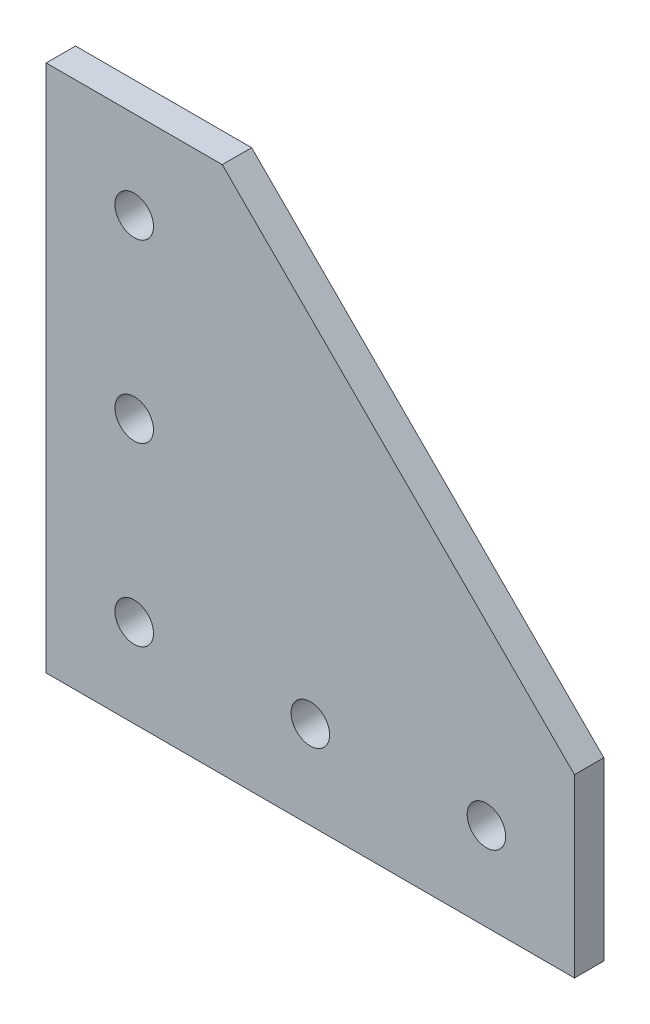
ISO-10303-21;
HEADER;
FILE_DESCRIPTION(('STEP AP214'),'2;1');
FILE_NAME('part.step','',(''),(''),'','','');
FILE_SCHEMA(('AUTOMOTIVE_DESIGN { 1 0 10303 214 1 1 1 1 }'));
ENDSEC;
DATA;
#1=APPLICATION_CONTEXT('core data for automotive mechanical design processes');
#2=APPLICATION_PROTOCOL_DEFINITION('international standard','automotive_design',2000,#1);
#3=PRODUCT_CONTEXT('',#1,'mechanical');
#4=PRODUCT('Part','Part','',(#3));
#5=PRODUCT_RELATED_PRODUCT_CATEGORY('part','',(#4));
#6=PRODUCT_DEFINITION_FORMATION('','',#4);
#7=PRODUCT_DEFINITION_CONTEXT('part definition',#1,'design');
#8=PRODUCT_DEFINITION('design','',#6,#7);
#9=PRODUCT_DEFINITION_SHAPE('','',#8);
#10=(LENGTH_UNIT() NAMED_UNIT(*) SI_UNIT(.MILLI.,.METRE.));
#11=(NAMED_UNIT(*) PLANE_ANGLE_UNIT() SI_UNIT($,.RADIAN.));
#12=(NAMED_UNIT(*) SI_UNIT($,.STERADIAN.) SOLID_ANGLE_UNIT());
#13=UNCERTAINTY_MEASURE_WITH_UNIT(LENGTH_MEASURE(1.E-05),#10,'distance_accuracy_value','');
#14=(GEOMETRIC_REPRESENTATION_CONTEXT(3) GLOBAL_UNCERTAINTY_ASSIGNED_CONTEXT((#13)) GLOBAL_UNIT_ASSIGNED_CONTEXT((#10,
#11,#12)) REPRESENTATION_CONTEXT('',''));
#15=CARTESIAN_POINT('',(0.,0.,0.));
#16=DIRECTION('',(0.,0.,1.));
#17=DIRECTION('',(1.,0.,0.));
#18=AXIS2_PLACEMENT_3D('',#15,#16,#17);
#19=CARTESIAN_POINT('',(114.3,0.,6.35));
#20=DIRECTION('',(0.,1.,0.));
#21=DIRECTION('',(-1.,0.,0.));
#22=AXIS2_PLACEMENT_3D('',#19,#20,#21);
#23=PLANE('',#22);
#24=DIRECTION('',(1.,0.,0.));
#25=VECTOR('',#24,1.);
#26=CARTESIAN_POINT('',(114.3,0.,0.));
#27=LINE('',#26,#25);
#28=CARTESIAN_POINT('',(0.,0.,0.));
#29=VERTEX_POINT('',#28);
#30=CARTESIAN_POINT('',(114.3,0.,0.));
#31=VERTEX_POINT('',#30);
#32=EDGE_CURVE('E83',#29,#31,#27,.T.);
#33=ORIENTED_EDGE('',*,*,#32,.T.);
#34=DIRECTION('',(0.,0.,-1.));
#35=VECTOR('',#34,1.);
#36=CARTESIAN_POINT('',(114.3,0.,6.35));
#37=LINE('',#36,#35);
#38=CARTESIAN_POINT('',(114.3,0.,6.35));
#39=VERTEX_POINT('',#38);
#40=EDGE_CURVE('E91',#39,#31,#37,.T.);
#41=ORIENTED_EDGE('',*,*,#40,.F.);
#42=DIRECTION('',(1.,0.,0.));
#43=VECTOR('',#42,1.);
#44=CARTESIAN_POINT('',(114.3,0.,6.35));
#45=LINE('',#44,#43);
#46=CARTESIAN_POINT('',(0.,0.,6.35));
#47=VERTEX_POINT('',#46);
#48=EDGE_CURVE('E112',#47,#39,#45,.T.);
#49=ORIENTED_EDGE('',*,*,#48,.F.);
#50=DIRECTION('',(0.,0.,-1.));
#51=VECTOR('',#50,1.);
#52=CARTESIAN_POINT('',(0.,0.,6.35));
#53=LINE('',#52,#51);
#54=EDGE_CURVE('E99',#47,#29,#53,.T.);
#55=ORIENTED_EDGE('',*,*,#54,.T.);
#56=EDGE_LOOP('',(#33,#41,#49,#55));
#57=FACE_BOUND('',#56,.T.);
#58=ADVANCED_FACE('F30',(#57),#23,.F.);
#59=CARTESIAN_POINT('',(114.3,38.1,6.35));
#60=DIRECTION('',(-1.,0.,0.));
#61=DIRECTION('',(0.,-1.,0.));
#62=AXIS2_PLACEMENT_3D('',#59,#60,#61);
#63=PLANE('',#62);
#64=DIRECTION('',(0.,1.,0.));
#65=VECTOR('',#64,1.);
#66=CARTESIAN_POINT('',(114.3,38.1,0.));
#67=LINE('',#66,#65);
#68=CARTESIAN_POINT('',(114.3,38.1,0.));
#69=VERTEX_POINT('',#68);
#70=EDGE_CURVE('E77',#31,#69,#67,.T.);
#71=ORIENTED_EDGE('',*,*,#70,.T.);
#72=DIRECTION('',(0.,0.,-1.));
#73=VECTOR('',#72,1.);
#74=CARTESIAN_POINT('',(114.3,38.1,6.35));
#75=LINE('',#74,#73);
#76=CARTESIAN_POINT('',(114.3,38.1,6.35));
#77=VERTEX_POINT('',#76);
#78=EDGE_CURVE('E96',#77,#69,#75,.T.);
#79=ORIENTED_EDGE('',*,*,#78,.F.);
#80=DIRECTION('',(0.,1.,0.));
#81=VECTOR('',#80,1.);
#82=CARTESIAN_POINT('',(114.3,38.1,6.35));
#83=LINE('',#82,#81);
#84=EDGE_CURVE('E93',#39,#77,#83,.T.);
#85=ORIENTED_EDGE('',*,*,#84,.F.);
#86=ORIENTED_EDGE('',*,*,#40,.T.);
#87=EDGE_LOOP('',(#71,#79,#85,#86));
#88=FACE_BOUND('',#87,.T.);
#89=ADVANCED_FACE('F92',(#88),#63,.F.);
#90=CARTESIAN_POINT('',(38.1,114.3,6.35));
#91=DIRECTION('',(-0.707106781186547,-0.707106781186548,0.));
#92=DIRECTION('',(0.707106781186548,-0.707106781186547,0.));
#93=AXIS2_PLACEMENT_3D('',#90,#91,#92);
#94=PLANE('',#93);
#95=DIRECTION('',(-0.707106781186548,0.707106781186547,0.));
#96=VECTOR('',#95,1.);
#97=CARTESIAN_POINT('',(38.1,114.3,0.));
#98=LINE('',#97,#96);
#99=CARTESIAN_POINT('',(38.1,114.3,0.));
#100=VERTEX_POINT('',#99);
#101=EDGE_CURVE('E85',#69,#100,#98,.T.);
#102=ORIENTED_EDGE('',*,*,#101,.T.);
#103=DIRECTION('',(0.,0.,-1.));
#104=VECTOR('',#103,1.);
#105=CARTESIAN_POINT('',(38.1,114.3,6.35));
#106=LINE('',#105,#104);
#107=CARTESIAN_POINT('',(38.1,114.3,6.35));
#108=VERTEX_POINT('',#107);
#109=EDGE_CURVE('E123',#108,#100,#106,.T.);
#110=ORIENTED_EDGE('',*,*,#109,.F.);
#111=DIRECTION('',(-0.707106781186548,0.707106781186547,0.));
#112=VECTOR('',#111,1.);
#113=CARTESIAN_POINT('',(38.1,114.3,6.35));
#114=LINE('',#113,#112);
#115=EDGE_CURVE('E115',#77,#108,#114,.T.);
#116=ORIENTED_EDGE('',*,*,#115,.F.);
#117=ORIENTED_EDGE('',*,*,#78,.T.);
#118=EDGE_LOOP('',(#102,#110,#116,#117));
#119=FACE_BOUND('',#118,.T.);
#120=ADVANCED_FACE('F156',(#119),#94,.F.);
#121=CARTESIAN_POINT('',(0.,114.3,6.35));
#122=DIRECTION('',(0.,-1.,0.));
#123=DIRECTION('',(0.,0.,-1.));
#124=AXIS2_PLACEMENT_3D('',#121,#122,#123);
#125=PLANE('',#124);
#126=DIRECTION('',(-1.,0.,0.));
#127=VECTOR('',#126,1.);
#128=CARTESIAN_POINT('',(0.,114.3,0.));
#129=LINE('',#128,#127);
#130=CARTESIAN_POINT('',(0.,114.3,0.));
#131=VERTEX_POINT('',#130);
#132=EDGE_CURVE('E108',#100,#131,#129,.T.);
#133=ORIENTED_EDGE('',*,*,#132,.T.);
#134=DIRECTION('',(0.,0.,-1.));
#135=VECTOR('',#134,1.);
#136=CARTESIAN_POINT('',(0.,114.3,6.35));
#137=LINE('',#136,#135);
#138=CARTESIAN_POINT('',(0.,114.3,6.35));
#139=VERTEX_POINT('',#138);
#140=EDGE_CURVE('E120',#139,#131,#137,.T.);
#141=ORIENTED_EDGE('',*,*,#140,.F.);
#142=DIRECTION('',(-1.,0.,0.));
#143=VECTOR('',#142,1.);
#144=CARTESIAN_POINT('',(0.,114.3,6.35));
#145=LINE('',#144,#143);
#146=EDGE_CURVE('E50',#108,#139,#145,.T.);
#147=ORIENTED_EDGE('',*,*,#146,.F.);
#148=ORIENTED_EDGE('',*,*,#109,.T.);
#149=EDGE_LOOP('',(#133,#141,#147,#148));
#150=FACE_BOUND('',#149,.T.);
#151=ADVANCED_FACE('F147',(#150),#125,.F.);
#152=CARTESIAN_POINT('',(0.,0.,6.35));
#153=DIRECTION('',(1.,0.,0.));
#154=DIRECTION('',(0.,0.,-1.));
#155=AXIS2_PLACEMENT_3D('',#152,#153,#154);
#156=PLANE('',#155);
#157=DIRECTION('',(0.,-1.,0.));
#158=VECTOR('',#157,1.);
#159=CARTESIAN_POINT('',(0.,0.,0.));
#160=LINE('',#159,#158);
#161=EDGE_CURVE('E110',#131,#29,#160,.T.);
#162=ORIENTED_EDGE('',*,*,#161,.T.);
#163=ORIENTED_EDGE('',*,*,#54,.F.);
#164=DIRECTION('',(0.,-1.,0.));
#165=VECTOR('',#164,1.);
#166=CARTESIAN_POINT('',(0.,0.,6.35));
#167=LINE('',#166,#165);
#168=EDGE_CURVE('E45',#139,#47,#167,.T.);
#169=ORIENTED_EDGE('',*,*,#168,.F.);
#170=ORIENTED_EDGE('',*,*,#140,.T.);
#171=EDGE_LOOP('',(#162,#163,#169,#170));
#172=FACE_BOUND('',#171,.T.);
#173=ADVANCED_FACE('F137',(#172),#156,.F.);
#174=CARTESIAN_POINT('',(0.,0.,6.35));
#175=DIRECTION('',(0.,0.,-1.));
#176=DIRECTION('',(-1.,0.,0.));
#177=AXIS2_PLACEMENT_3D('',#174,#175,#176);
#178=PLANE('',#177);
#179=CARTESIAN_POINT('',(19.05,95.25,6.35));
#180=DIRECTION('',(0.,0.,1.));
#181=DIRECTION('',(1.,0.,0.));
#182=AXIS2_PLACEMENT_3D('',#179,#180,#181);
#183=CIRCLE('',#182,4.1656);
#184=CARTESIAN_POINT('',(23.2156,95.25,6.35));
#185=VERTEX_POINT('',#184);
#186=EDGE_CURVE('E236',#185,#185,#183,.T.);
#187=ORIENTED_EDGE('',*,*,#186,.F.);
#188=EDGE_LOOP('',(#187));
#189=FACE_BOUND('',#188,.T.);
#190=CARTESIAN_POINT('',(19.05,57.15,6.35));
#191=DIRECTION('',(0.,0.,1.));
#192=DIRECTION('',(1.,0.,0.));
#193=AXIS2_PLACEMENT_3D('',#190,#191,#192);
#194=CIRCLE('',#193,4.1656);
#195=CARTESIAN_POINT('',(23.2156,57.15,6.35));
#196=VERTEX_POINT('',#195);
#197=EDGE_CURVE('E237',#196,#196,#194,.T.);
#198=ORIENTED_EDGE('',*,*,#197,.F.);
#199=EDGE_LOOP('',(#198));
#200=FACE_BOUND('',#199,.T.);
#201=CARTESIAN_POINT('',(57.15,19.05,6.35));
#202=DIRECTION('',(0.,0.,1.));
#203=DIRECTION('',(1.,0.,0.));
#204=AXIS2_PLACEMENT_3D('',#201,#202,#203);
#205=CIRCLE('',#204,4.1656);
#206=CARTESIAN_POINT('',(61.3156,19.05,6.35));
#207=VERTEX_POINT('',#206);
#208=EDGE_CURVE('E249',#207,#207,#205,.T.);
#209=ORIENTED_EDGE('',*,*,#208,.F.);
#210=EDGE_LOOP('',(#209));
#211=FACE_BOUND('',#210,.T.);
#212=CARTESIAN_POINT('',(19.05,19.05,6.35));
#213=DIRECTION('',(0.,0.,1.));
#214=DIRECTION('',(1.,0.,0.));
#215=AXIS2_PLACEMENT_3D('',#212,#213,#214);
#216=CIRCLE('',#215,4.1656);
#217=CARTESIAN_POINT('',(23.2156,19.05,6.35));
#218=VERTEX_POINT('',#217);
#219=EDGE_CURVE('E103',#218,#218,#216,.T.);
#220=ORIENTED_EDGE('',*,*,#219,.F.);
#221=EDGE_LOOP('',(#220));
#222=FACE_BOUND('',#221,.T.);
#223=ORIENTED_EDGE('',*,*,#48,.T.);
#224=ORIENTED_EDGE('',*,*,#84,.T.);
#225=ORIENTED_EDGE('',*,*,#115,.T.);
#226=ORIENTED_EDGE('',*,*,#146,.T.);
#227=ORIENTED_EDGE('',*,*,#168,.T.);
#228=EDGE_LOOP('',(#223,#224,#225,#226,#227));
#229=FACE_BOUND('',#228,.T.);
#230=CARTESIAN_POINT('',(95.25,19.05,6.35));
#231=DIRECTION('',(0.,0.,1.));
#232=DIRECTION('',(1.,0.,0.));
#233=AXIS2_PLACEMENT_3D('',#230,#231,#232);
#234=CIRCLE('',#233,4.1656);
#235=CARTESIAN_POINT('',(99.4156,19.05,6.35));
#236=VERTEX_POINT('',#235);
#237=EDGE_CURVE('E11',#236,#236,#234,.T.);
#238=ORIENTED_EDGE('',*,*,#237,.F.);
#239=EDGE_LOOP('',(#238));
#240=FACE_BOUND('',#239,.T.);
#241=ADVANCED_FACE('F135',(#189,#200,#211,#222,#229,#240),#178,.F.);
#242=CARTESIAN_POINT('',(0.,0.,0.));
#243=DIRECTION('',(0.,0.,-1.));
#244=DIRECTION('',(-1.,0.,0.));
#245=AXIS2_PLACEMENT_3D('',#242,#243,#244);
#246=PLANE('',#245);
#247=CARTESIAN_POINT('',(19.05,95.25,0.));
#248=DIRECTION('',(0.,0.,1.));
#249=DIRECTION('',(1.,0.,0.));
#250=AXIS2_PLACEMENT_3D('',#247,#248,#249);
#251=CIRCLE('',#250,4.1656);
#252=CARTESIAN_POINT('',(23.2156,95.25,0.));
#253=VERTEX_POINT('',#252);
#254=EDGE_CURVE('E234',#253,#253,#251,.T.);
#255=ORIENTED_EDGE('',*,*,#254,.T.);
#256=EDGE_LOOP('',(#255));
#257=FACE_BOUND('',#256,.T.);
#258=CARTESIAN_POINT('',(19.05,57.15,0.));
#259=DIRECTION('',(0.,0.,1.));
#260=DIRECTION('',(1.,0.,0.));
#261=AXIS2_PLACEMENT_3D('',#258,#259,#260);
#262=CIRCLE('',#261,4.1656);
#263=CARTESIAN_POINT('',(23.2156,57.15,0.));
#264=VERTEX_POINT('',#263);
#265=EDGE_CURVE('E240',#264,#264,#262,.T.);
#266=ORIENTED_EDGE('',*,*,#265,.T.);
#267=EDGE_LOOP('',(#266));
#268=FACE_BOUND('',#267,.T.);
#269=CARTESIAN_POINT('',(57.15,19.05,0.));
#270=DIRECTION('',(0.,0.,1.));
#271=DIRECTION('',(1.,0.,0.));
#272=AXIS2_PLACEMENT_3D('',#269,#270,#271);
#273=CIRCLE('',#272,4.1656);
#274=CARTESIAN_POINT('',(61.3156,19.05,0.));
#275=VERTEX_POINT('',#274);
#276=EDGE_CURVE('E246',#275,#275,#273,.T.);
#277=ORIENTED_EDGE('',*,*,#276,.T.);
#278=EDGE_LOOP('',(#277));
#279=FACE_BOUND('',#278,.T.);
#280=CARTESIAN_POINT('',(19.05,19.05,0.));
#281=DIRECTION('',(0.,0.,1.));
#282=DIRECTION('',(1.,0.,0.));
#283=AXIS2_PLACEMENT_3D('',#280,#281,#282);
#284=CIRCLE('',#283,4.1656);
#285=CARTESIAN_POINT('',(23.2156,19.05,0.));
#286=VERTEX_POINT('',#285);
#287=EDGE_CURVE('E100',#286,#286,#284,.T.);
#288=ORIENTED_EDGE('',*,*,#287,.T.);
#289=EDGE_LOOP('',(#288));
#290=FACE_BOUND('',#289,.T.);
#291=ORIENTED_EDGE('',*,*,#32,.F.);
#292=ORIENTED_EDGE('',*,*,#161,.F.);
#293=ORIENTED_EDGE('',*,*,#132,.F.);
#294=ORIENTED_EDGE('',*,*,#101,.F.);
#295=ORIENTED_EDGE('',*,*,#70,.F.);
#296=EDGE_LOOP('',(#291,#292,#293,#294,#295));
#297=FACE_BOUND('',#296,.T.);
#298=CARTESIAN_POINT('',(95.25,19.05,0.));
#299=DIRECTION('',(0.,0.,1.));
#300=DIRECTION('',(1.,0.,0.));
#301=AXIS2_PLACEMENT_3D('',#298,#299,#300);
#302=CIRCLE('',#301,4.1656);
#303=CARTESIAN_POINT('',(99.4156,19.05,0.));
#304=VERTEX_POINT('',#303);
#305=EDGE_CURVE('E38',#304,#304,#302,.T.);
#306=ORIENTED_EDGE('',*,*,#305,.T.);
#307=EDGE_LOOP('',(#306));
#308=FACE_BOUND('',#307,.T.);
#309=ADVANCED_FACE('F79',(#257,#268,#279,#290,#297,#308),#246,.T.);
#310=CARTESIAN_POINT('',(19.05,19.05,0.));
#311=DIRECTION('',(0.,0.,1.));
#312=DIRECTION('',(1.,0.,0.));
#313=AXIS2_PLACEMENT_3D('',#310,#311,#312);
#314=CYLINDRICAL_SURFACE('',#313,4.1656);
#315=ORIENTED_EDGE('',*,*,#287,.F.);
#316=EDGE_LOOP('',(#315));
#317=FACE_BOUND('',#316,.T.);
#318=ORIENTED_EDGE('',*,*,#219,.T.);
#319=EDGE_LOOP('',(#318));
#320=FACE_BOUND('',#319,.T.);
#321=ADVANCED_FACE('F144',(#317,#320),#314,.F.);
#322=CARTESIAN_POINT('',(57.15,19.05,0.));
#323=DIRECTION('',(0.,0.,1.));
#324=DIRECTION('',(1.,0.,0.));
#325=AXIS2_PLACEMENT_3D('',#322,#323,#324);
#326=CYLINDRICAL_SURFACE('',#325,4.1656);
#327=ORIENTED_EDGE('',*,*,#276,.F.);
#328=EDGE_LOOP('',(#327));
#329=FACE_BOUND('',#328,.T.);
#330=ORIENTED_EDGE('',*,*,#208,.T.);
#331=EDGE_LOOP('',(#330));
#332=FACE_BOUND('',#331,.T.);
#333=ADVANCED_FACE('F132',(#329,#332),#326,.F.);
#334=CARTESIAN_POINT('',(95.25,19.05,0.));
#335=DIRECTION('',(0.,0.,1.));
#336=DIRECTION('',(1.,0.,0.));
#337=AXIS2_PLACEMENT_3D('',#334,#335,#336);
#338=CYLINDRICAL_SURFACE('',#337,4.1656);
#339=ORIENTED_EDGE('',*,*,#305,.F.);
#340=EDGE_LOOP('',(#339));
#341=FACE_BOUND('',#340,.T.);
#342=ORIENTED_EDGE('',*,*,#237,.T.);
#343=EDGE_LOOP('',(#342));
#344=FACE_BOUND('',#343,.T.);
#345=ADVANCED_FACE('F32',(#341,#344),#338,.F.);
#346=CARTESIAN_POINT('',(19.05,57.15,0.));
#347=DIRECTION('',(0.,0.,1.));
#348=DIRECTION('',(1.,0.,0.));
#349=AXIS2_PLACEMENT_3D('',#346,#347,#348);
#350=CYLINDRICAL_SURFACE('',#349,4.1656);
#351=ORIENTED_EDGE('',*,*,#265,.F.);
#352=EDGE_LOOP('',(#351));
#353=FACE_BOUND('',#352,.T.);
#354=ORIENTED_EDGE('',*,*,#197,.T.);
#355=EDGE_LOOP('',(#354));
#356=FACE_BOUND('',#355,.T.);
#357=ADVANCED_FACE('F131',(#353,#356),#350,.F.);
#358=CARTESIAN_POINT('',(19.05,95.25,0.));
#359=DIRECTION('',(0.,0.,1.));
#360=DIRECTION('',(1.,0.,0.));
#361=AXIS2_PLACEMENT_3D('',#358,#359,#360);
#362=CYLINDRICAL_SURFACE('',#361,4.1656);
#363=ORIENTED_EDGE('',*,*,#254,.F.);
#364=EDGE_LOOP('',(#363));
#365=FACE_BOUND('',#364,.T.);
#366=ORIENTED_EDGE('',*,*,#186,.T.);
#367=EDGE_LOOP('',(#366));
#368=FACE_BOUND('',#367,.T.);
#369=ADVANCED_FACE('F208',(#365,#368),#362,.F.);
#370=CLOSED_SHELL('',(#58,#89,#120,#151,#173,#241,#309,#321,#333,#345,#357,#369));
#371=MANIFOLD_SOLID_BREP('B2',#370);
#372=ADVANCED_BREP_SHAPE_REPRESENTATION('',(#18,#371),#14);
#373=SHAPE_DEFINITION_REPRESENTATION(#9,#372);
ENDSEC;
END-ISO-10303-21;
